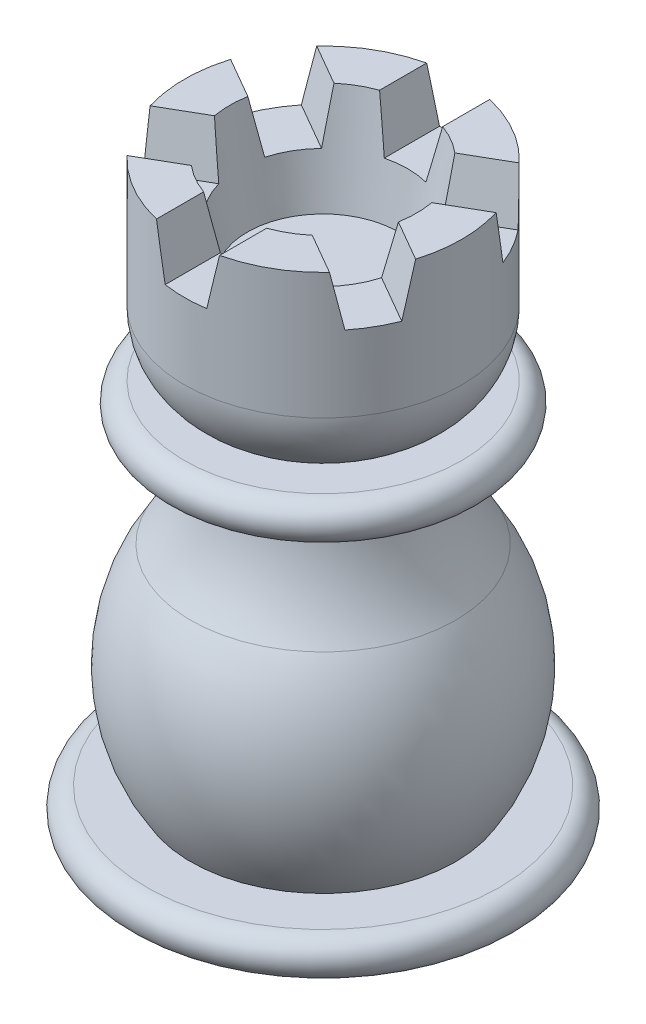
ISO-10303-21;
HEADER;
FILE_DESCRIPTION(('STEP AP214'),'2;1');
FILE_NAME('part.step','',(''),(''),'','','');
FILE_SCHEMA(('AUTOMOTIVE_DESIGN { 1 0 10303 214 1 1 1 1 }'));
ENDSEC;
DATA;
#1=APPLICATION_CONTEXT('core data for automotive mechanical design processes');
#2=APPLICATION_PROTOCOL_DEFINITION('international standard','automotive_design',2000,#1);
#3=PRODUCT_CONTEXT('',#1,'mechanical');
#4=PRODUCT('Part','Part','',(#3));
#5=PRODUCT_RELATED_PRODUCT_CATEGORY('part','',(#4));
#6=PRODUCT_DEFINITION_FORMATION('','',#4);
#7=PRODUCT_DEFINITION_CONTEXT('part definition',#1,'design');
#8=PRODUCT_DEFINITION('design','',#6,#7);
#9=PRODUCT_DEFINITION_SHAPE('','',#8);
#10=(LENGTH_UNIT() NAMED_UNIT(*) SI_UNIT(.MILLI.,.METRE.));
#11=(NAMED_UNIT(*) PLANE_ANGLE_UNIT() SI_UNIT($,.RADIAN.));
#12=(NAMED_UNIT(*) SI_UNIT($,.STERADIAN.) SOLID_ANGLE_UNIT());
#13=UNCERTAINTY_MEASURE_WITH_UNIT(LENGTH_MEASURE(1.E-05),#10,'distance_accuracy_value','');
#14=(GEOMETRIC_REPRESENTATION_CONTEXT(3) GLOBAL_UNCERTAINTY_ASSIGNED_CONTEXT((#13)) GLOBAL_UNIT_ASSIGNED_CONTEXT((#10,
#11,#12)) REPRESENTATION_CONTEXT('',''));
#15=CARTESIAN_POINT('',(0.,0.,0.));
#16=DIRECTION('',(0.,0.,1.));
#17=DIRECTION('',(1.,0.,0.));
#18=AXIS2_PLACEMENT_3D('',#15,#16,#17);
#19=CARTESIAN_POINT('',(11.,46.,0.));
#20=DIRECTION('',(0.,1.,0.));
#21=DIRECTION('',(-1.,0.,0.));
#22=AXIS2_PLACEMENT_3D('',#19,#20,#21);
#23=PLANE('',#22);
#24=CARTESIAN_POINT('',(0.,46.,0.));
#25=DIRECTION('',(0.,1.,0.));
#26=DIRECTION('',(0.,0.,1.));
#27=AXIS2_PLACEMENT_3D('',#24,#25,#26);
#28=CIRCLE('',#27,7.41061584566766);
#29=CARTESIAN_POINT('',(4.79155777999733,46.,-5.65315852006715));
#30=VERTEX_POINT('',#29);
#31=CARTESIAN_POINT('',(2.5,46.,-6.97619002121221));
#32=VERTEX_POINT('',#31);
#33=EDGE_CURVE('E315',#30,#32,#28,.T.);
#34=ORIENTED_EDGE('',*,*,#33,.F.);
#35=DIRECTION('',(0.866025403784443,0.,-0.499999999999992));
#36=VECTOR('',#35,1.);
#37=CARTESIAN_POINT('',(-19.5866968793294,46.,8.42163336986809));
#38=LINE('',#37,#36);
#39=CARTESIAN_POINT('',(8.02698765763981,46.,-7.52113483086816));
#40=VERTEX_POINT('',#39);
#41=EDGE_CURVE('E453',#30,#40,#38,.T.);
#42=ORIENTED_EDGE('',*,*,#41,.T.);
#43=CARTESIAN_POINT('',(0.,46.,0.));
#44=DIRECTION('',(0.,-1.,0.));
#45=DIRECTION('',(1.,0.,0.));
#46=AXIS2_PLACEMENT_3D('',#43,#44,#45);
#47=CIRCLE('',#46,11.);
#48=CARTESIAN_POINT('',(2.5,46.,-10.7121426428143));
#49=VERTEX_POINT('',#48);
#50=EDGE_CURVE('E314',#49,#40,#47,.T.);
#51=ORIENTED_EDGE('',*,*,#50,.F.);
#52=DIRECTION('',(0.,0.,1.));
#53=VECTOR('',#52,1.);
#54=CARTESIAN_POINT('',(2.5,46.,-15.5));
#55=LINE('',#54,#53);
#56=EDGE_CURVE('E274',#49,#32,#55,.T.);
#57=ORIENTED_EDGE('',*,*,#56,.T.);
#58=EDGE_LOOP('',(#34,#42,#51,#57));
#59=FACE_BOUND('',#58,.T.);
#60=ADVANCED_FACE('F42',(#59),#23,.T.);
#61=CARTESIAN_POINT('',(8.0269876576397,46.,7.52113483086827));
#62=VERTEX_POINT('',#61);
#63=CARTESIAN_POINT('',(2.5,46.,10.7121426428143));
#64=VERTEX_POINT('',#63);
#65=EDGE_CURVE('E309',#62,#64,#47,.T.);
#66=ORIENTED_EDGE('',*,*,#65,.F.);
#67=DIRECTION('',(-0.866025403784436,0.,-0.500000000000004));
#68=VECTOR('',#67,1.);
#69=CARTESIAN_POINT('',(17.0866968793294,46.,12.7517603887906));
#70=LINE('',#69,#68);
#71=CARTESIAN_POINT('',(4.79155777999723,46.,5.65315852006721));
#72=VERTEX_POINT('',#71);
#73=EDGE_CURVE('E236',#62,#72,#70,.T.);
#74=ORIENTED_EDGE('',*,*,#73,.T.);
#75=CARTESIAN_POINT('',(2.5,46.,6.9761900212122));
#76=VERTEX_POINT('',#75);
#77=EDGE_CURVE('E308',#76,#72,#28,.T.);
#78=ORIENTED_EDGE('',*,*,#77,.F.);
#79=EDGE_CURVE('E271',#76,#64,#55,.T.);
#80=ORIENTED_EDGE('',*,*,#79,.T.);
#81=EDGE_LOOP('',(#66,#74,#78,#80));
#82=FACE_BOUND('',#81,.T.);
#83=ADVANCED_FACE('F512',(#82),#23,.T.);
#84=CARTESIAN_POINT('',(-7.29155777999726,46.,-1.32303150114503));
#85=VERTEX_POINT('',#84);
#86=CARTESIAN_POINT('',(-7.29155777999728,46.,1.32303150114493));
#87=VERTEX_POINT('',#86);
#88=EDGE_CURVE('E468',#85,#87,#28,.T.);
#89=ORIENTED_EDGE('',*,*,#88,.F.);
#90=CARTESIAN_POINT('',(-10.5269876576397,46.,-3.19100781194609));
#91=VERTEX_POINT('',#90);
#92=EDGE_CURVE('E242',#85,#91,#70,.T.);
#93=ORIENTED_EDGE('',*,*,#92,.T.);
#94=CARTESIAN_POINT('',(-10.5269876576398,46.,3.19100781194594));
#95=VERTEX_POINT('',#94);
#96=EDGE_CURVE('E572',#95,#91,#47,.T.);
#97=ORIENTED_EDGE('',*,*,#96,.F.);
#98=EDGE_CURVE('E447',#95,#87,#38,.T.);
#99=ORIENTED_EDGE('',*,*,#98,.T.);
#100=EDGE_LOOP('',(#89,#93,#97,#99));
#101=FACE_BOUND('',#100,.T.);
#102=ADVANCED_FACE('F520',(#101),#23,.T.);
#103=DIRECTION('',(-0.866025403784436,0.,-0.500000000000004));
#104=VECTOR('',#103,1.);
#105=CARTESIAN_POINT('',(19.5866968793294,46.,8.42163336986841));
#106=LINE('',#105,#104);
#107=CARTESIAN_POINT('',(-4.79155777999724,46.,-5.65315852006722));
#108=VERTEX_POINT('',#107);
#109=CARTESIAN_POINT('',(-8.0269876576397,46.,-7.52113483086827));
#110=VERTEX_POINT('',#109);
#111=EDGE_CURVE('E250',#108,#110,#106,.T.);
#112=ORIENTED_EDGE('',*,*,#111,.F.);
#113=CARTESIAN_POINT('',(-2.5,46.,-6.9761900212122));
#114=VERTEX_POINT('',#113);
#115=EDGE_CURVE('E311',#114,#108,#28,.T.);
#116=ORIENTED_EDGE('',*,*,#115,.F.);
#117=DIRECTION('',(0.,0.,1.));
#118=VECTOR('',#117,1.);
#119=CARTESIAN_POINT('',(-2.5,46.,-15.5));
#120=LINE('',#119,#118);
#121=CARTESIAN_POINT('',(-2.5,46.,-10.7121426428143));
#122=VERTEX_POINT('',#121);
#123=EDGE_CURVE('E289',#122,#114,#120,.T.);
#124=ORIENTED_EDGE('',*,*,#123,.F.);
#125=EDGE_CURVE('E318',#110,#122,#47,.T.);
#126=ORIENTED_EDGE('',*,*,#125,.F.);
#127=EDGE_LOOP('',(#112,#116,#124,#126));
#128=FACE_BOUND('',#127,.T.);
#129=ADVANCED_FACE('F535',(#128),#23,.T.);
#130=CARTESIAN_POINT('',(10.5269876576397,46.,3.19100781194609));
#131=VERTEX_POINT('',#130);
#132=CARTESIAN_POINT('',(7.29155777999726,46.,1.32303150114503));
#133=VERTEX_POINT('',#132);
#134=EDGE_CURVE('E441',#131,#133,#106,.T.);
#135=ORIENTED_EDGE('',*,*,#134,.F.);
#136=CARTESIAN_POINT('',(10.5269876576398,46.,-3.19100781194594));
#137=VERTEX_POINT('',#136);
#138=EDGE_CURVE('E317',#137,#131,#47,.T.);
#139=ORIENTED_EDGE('',*,*,#138,.F.);
#140=DIRECTION('',(0.866025403784443,0.,-0.499999999999992));
#141=VECTOR('',#140,1.);
#142=CARTESIAN_POINT('',(-17.0866968793295,46.,12.7517603887903));
#143=LINE('',#142,#141);
#144=CARTESIAN_POINT('',(7.29155777999728,46.,-1.32303150114493));
#145=VERTEX_POINT('',#144);
#146=EDGE_CURVE('E424',#145,#137,#143,.T.);
#147=ORIENTED_EDGE('',*,*,#146,.F.);
#148=EDGE_CURVE('E313',#133,#145,#28,.T.);
#149=ORIENTED_EDGE('',*,*,#148,.F.);
#150=EDGE_LOOP('',(#135,#139,#147,#149));
#151=FACE_BOUND('',#150,.T.);
#152=ADVANCED_FACE('F427',(#151),#23,.T.);
#153=CARTESIAN_POINT('',(0.,0.,0.));
#154=DIRECTION('',(0.,-1.,0.));
#155=DIRECTION('',(1.,0.,0.));
#156=AXIS2_PLACEMENT_3D('',#153,#154,#155);
#157=PLANE('',#156);
#158=CARTESIAN_POINT('',(0.,0.,0.));
#159=DIRECTION('',(0.,-1.,0.));
#160=DIRECTION('',(1.,0.,0.));
#161=AXIS2_PLACEMENT_3D('',#158,#159,#160);
#162=CIRCLE('',#161,14.);
#163=CARTESIAN_POINT('',(14.,0.,0.));
#164=VERTEX_POINT('',#163);
#165=EDGE_CURVE('E351',#164,#164,#162,.T.);
#166=ORIENTED_EDGE('',*,*,#165,.T.);
#167=EDGE_LOOP('',(#166));
#168=FACE_BOUND('',#167,.T.);
#169=ADVANCED_FACE('F46',(#168),#157,.T.);
#170=CARTESIAN_POINT('',(0.,1.5,0.));
#171=DIRECTION('',(0.,-1.,0.));
#172=DIRECTION('',(1.,0.,0.));
#173=AXIS2_PLACEMENT_3D('',#170,#171,#172);
#174=TOROIDAL_SURFACE('',#173,14.,1.5);
#175=CARTESIAN_POINT('',(0.,3.,0.));
#176=DIRECTION('',(0.,-1.,0.));
#177=DIRECTION('',(1.,0.,0.));
#178=AXIS2_PLACEMENT_3D('',#175,#176,#177);
#179=CIRCLE('',#178,14.);
#180=CARTESIAN_POINT('',(14.,3.,0.));
#181=VERTEX_POINT('',#180);
#182=EDGE_CURVE('E346',#181,#181,#179,.T.);
#183=ORIENTED_EDGE('',*,*,#182,.T.);
#184=EDGE_LOOP('',(#183));
#185=FACE_BOUND('',#184,.T.);
#186=ORIENTED_EDGE('',*,*,#165,.F.);
#187=EDGE_LOOP('',(#186));
#188=FACE_BOUND('',#187,.T.);
#189=ADVANCED_FACE('F540',(#185,#188),#174,.T.);
#190=CARTESIAN_POINT('',(14.,3.,0.));
#191=DIRECTION('',(0.,1.,0.));
#192=DIRECTION('',(-1.,0.,0.));
#193=AXIS2_PLACEMENT_3D('',#190,#191,#192);
#194=PLANE('',#193);
#195=CARTESIAN_POINT('',(0.,3.,0.));
#196=DIRECTION('',(0.,-1.,0.));
#197=DIRECTION('',(1.,0.,0.));
#198=AXIS2_PLACEMENT_3D('',#195,#196,#197);
#199=CIRCLE('',#198,10.5);
#200=CARTESIAN_POINT('',(10.5,3.,0.));
#201=VERTEX_POINT('',#200);
#202=EDGE_CURVE('E343',#201,#201,#199,.T.);
#203=ORIENTED_EDGE('',*,*,#202,.T.);
#204=EDGE_LOOP('',(#203));
#205=FACE_BOUND('',#204,.T.);
#206=ORIENTED_EDGE('',*,*,#182,.F.);
#207=EDGE_LOOP('',(#206));
#208=FACE_BOUND('',#207,.T.);
#209=ADVANCED_FACE('F797',(#205,#208),#194,.T.);
#210=CARTESIAN_POINT('',(0.,11.2915619761802,0.));
#211=DIRECTION('',(0.,-1.,0.));
#212=DIRECTION('',(1.,0.,0.));
#213=AXIS2_PLACEMENT_3D('',#210,#211,#212);
#214=DEGENERATE_TOROIDAL_SURFACE('',#213,1.99999999980649,15.,.F.);
#215=CARTESIAN_POINT('',(0.,19.5832509410501,0.));
#216=DIRECTION('',(0.,-1.,0.));
#217=DIRECTION('',(1.,0.,0.));
#218=AXIS2_PLACEMENT_3D('',#215,#216,#217);
#219=CIRCLE('',#218,10.4999157643039);
#220=CARTESIAN_POINT('',(10.4999157643039,19.5832509410501,0.));
#221=VERTEX_POINT('',#220);
#222=EDGE_CURVE('E337',#221,#221,#219,.T.);
#223=ORIENTED_EDGE('',*,*,#222,.T.);
#224=EDGE_LOOP('',(#223));
#225=FACE_BOUND('',#224,.T.);
#226=ORIENTED_EDGE('',*,*,#202,.F.);
#227=EDGE_LOOP('',(#226));
#228=FACE_BOUND('',#227,.T.);
#229=ADVANCED_FACE('F794',(#225,#228),#214,.F.);
#230=CARTESIAN_POINT('',(0.,27.87493990592,0.));
#231=DIRECTION('',(0.,-1.,0.));
#232=DIRECTION('',(1.,0.,0.));
#233=AXIS2_PLACEMENT_3D('',#230,#231,#232);
#234=TOROIDAL_SURFACE('',#233,22.9998315284143,15.);
#235=CARTESIAN_POINT('',(0.,27.8038475772934,0.));
#236=DIRECTION('',(0.,-1.,0.));
#237=DIRECTION('',(1.,0.,0.));
#238=AXIS2_PLACEMENT_3D('',#235,#236,#237);
#239=CIRCLE('',#238,8.);
#240=CARTESIAN_POINT('',(8.,27.8038475772934,0.));
#241=VERTEX_POINT('',#240);
#242=EDGE_CURVE('E339',#241,#241,#239,.T.);
#243=ORIENTED_EDGE('',*,*,#242,.T.);
#244=EDGE_LOOP('',(#243));
#245=FACE_BOUND('',#244,.T.);
#246=ORIENTED_EDGE('',*,*,#222,.F.);
#247=EDGE_LOOP('',(#246));
#248=FACE_BOUND('',#247,.T.);
#249=ADVANCED_FACE('F781',(#245,#248),#234,.F.);
#250=CARTESIAN_POINT('',(8.,27.8038475772934,0.));
#251=DIRECTION('',(0.,-1.,0.));
#252=DIRECTION('',(1.,0.,0.));
#253=AXIS2_PLACEMENT_3D('',#250,#251,#252);
#254=PLANE('',#253);
#255=CARTESIAN_POINT('',(0.,27.8038475772934,0.));
#256=DIRECTION('',(0.,-1.,0.));
#257=DIRECTION('',(1.,0.,0.));
#258=AXIS2_PLACEMENT_3D('',#255,#256,#257);
#259=CIRCLE('',#258,11.);
#260=CARTESIAN_POINT('',(11.,27.8038475772934,0.));
#261=VERTEX_POINT('',#260);
#262=EDGE_CURVE('E335',#261,#261,#259,.T.);
#263=ORIENTED_EDGE('',*,*,#262,.T.);
#264=EDGE_LOOP('',(#263));
#265=FACE_BOUND('',#264,.T.);
#266=ORIENTED_EDGE('',*,*,#242,.F.);
#267=EDGE_LOOP('',(#266));
#268=FACE_BOUND('',#267,.T.);
#269=ADVANCED_FACE('F774',(#265,#268),#254,.T.);
#270=CARTESIAN_POINT('',(0.,29.3038475772934,0.));
#271=DIRECTION('',(0.,-1.,0.));
#272=DIRECTION('',(1.,0.,0.));
#273=AXIS2_PLACEMENT_3D('',#270,#271,#272);
#274=TOROIDAL_SURFACE('',#273,11.,1.5);
#275=CARTESIAN_POINT('',(0.,30.8038475772934,0.));
#276=DIRECTION('',(0.,-1.,0.));
#277=DIRECTION('',(1.,0.,0.));
#278=AXIS2_PLACEMENT_3D('',#275,#276,#277);
#279=CIRCLE('',#278,11.);
#280=CARTESIAN_POINT('',(11.,30.8038475772934,0.));
#281=VERTEX_POINT('',#280);
#282=EDGE_CURVE('E327',#281,#281,#279,.T.);
#283=ORIENTED_EDGE('',*,*,#282,.T.);
#284=EDGE_LOOP('',(#283));
#285=FACE_BOUND('',#284,.T.);
#286=ORIENTED_EDGE('',*,*,#262,.F.);
#287=EDGE_LOOP('',(#286));
#288=FACE_BOUND('',#287,.T.);
#289=ADVANCED_FACE('F762',(#285,#288),#274,.T.);
#290=CARTESIAN_POINT('',(11.,30.8038475772934,0.));
#291=DIRECTION('',(0.,1.,0.));
#292=DIRECTION('',(-1.,0.,0.));
#293=AXIS2_PLACEMENT_3D('',#290,#291,#292);
#294=PLANE('',#293);
#295=CARTESIAN_POINT('',(0.,30.8038475772934,0.));
#296=DIRECTION('',(0.,-1.,0.));
#297=DIRECTION('',(1.,0.,0.));
#298=AXIS2_PLACEMENT_3D('',#295,#296,#297);
#299=CIRCLE('',#298,8.);
#300=CARTESIAN_POINT('',(8.,30.8038475772934,0.));
#301=VERTEX_POINT('',#300);
#302=EDGE_CURVE('E322',#301,#301,#299,.T.);
#303=ORIENTED_EDGE('',*,*,#302,.T.);
#304=EDGE_LOOP('',(#303));
#305=FACE_BOUND('',#304,.T.);
#306=ORIENTED_EDGE('',*,*,#282,.F.);
#307=EDGE_LOOP('',(#306));
#308=FACE_BOUND('',#307,.T.);
#309=ADVANCED_FACE('F754',(#305,#308),#294,.T.);
#310=CARTESIAN_POINT('',(0.,36.,0.));
#311=DIRECTION('',(0.,-1.,0.));
#312=DIRECTION('',(1.,0.,0.));
#313=AXIS2_PLACEMENT_3D('',#310,#311,#312);
#314=DEGENERATE_TOROIDAL_SURFACE('',#313,5.,6.,.T.);
#315=CARTESIAN_POINT('',(0.,36.,0.));
#316=DIRECTION('',(0.,-1.,0.));
#317=DIRECTION('',(1.,0.,0.));
#318=AXIS2_PLACEMENT_3D('',#315,#316,#317);
#319=CIRCLE('',#318,11.);
#320=CARTESIAN_POINT('',(11.,36.,0.));
#321=VERTEX_POINT('',#320);
#322=EDGE_CURVE('E319',#321,#321,#319,.T.);
#323=ORIENTED_EDGE('',*,*,#322,.T.);
#324=EDGE_LOOP('',(#323));
#325=FACE_BOUND('',#324,.T.);
#326=ORIENTED_EDGE('',*,*,#302,.F.);
#327=EDGE_LOOP('',(#326));
#328=FACE_BOUND('',#327,.T.);
#329=ADVANCED_FACE('F529',(#325,#328),#314,.T.);
#330=CARTESIAN_POINT('',(0.,-2.04682153022546E-11,0.));
#331=DIRECTION('',(0.,-1.,0.));
#332=DIRECTION('',(1.,0.,0.));
#333=AXIS2_PLACEMENT_3D('',#330,#331,#332);
#334=CYLINDRICAL_SURFACE('',#333,11.);
#335=CARTESIAN_POINT('',(0.,34.2384247263037,0.));
#336=DIRECTION('',(-0.489073800366907,-0.207911690817756,0.847100670886272));
#337=DIRECTION('',(0.103955845408879,-0.978147600733806,-0.180056805991952));
#338=AXIS2_PLACEMENT_3D('',#335,#336,#337);
#339=ELLIPSE('',#338,52.9070777921862,11.);
#340=CARTESIAN_POINT('',(-10.2434156854571,42.,-4.00904416225749));
#341=VERTEX_POINT('',#340);
#342=EDGE_CURVE('E270',#341,#91,#339,.F.);
#343=ORIENTED_EDGE('',*,*,#342,.F.);
#344=CARTESIAN_POINT('',(0.,42.,0.));
#345=DIRECTION('',(0.,-1.,0.));
#346=DIRECTION('',(1.,0.,0.));
#347=AXIS2_PLACEMENT_3D('',#344,#345,#346);
#348=CIRCLE('',#347,11.);
#349=CARTESIAN_POINT('',(-8.59364193213719,42.,-6.8665361240012));
#350=VERTEX_POINT('',#349);
#351=EDGE_CURVE('E220',#350,#341,#348,.F.);
#352=ORIENTED_EDGE('',*,*,#351,.F.);
#353=CARTESIAN_POINT('',(0.,34.2384247263037,0.));
#354=DIRECTION('',(0.489073800366907,-0.207911690817756,-0.847100670886272));
#355=DIRECTION('',(-0.103955845408879,-0.978147600733806,0.180056805991952));
#356=AXIS2_PLACEMENT_3D('',#353,#354,#355);
#357=ELLIPSE('',#356,52.9070777921862,11.);
#358=EDGE_CURVE('E262',#110,#350,#357,.F.);
#359=ORIENTED_EDGE('',*,*,#358,.F.);
#360=ORIENTED_EDGE('',*,*,#125,.T.);
#361=CARTESIAN_POINT('',(0.,34.2384247263037,0.));
#362=DIRECTION('',(-0.978147600733806,-0.207911690817756,0.));
#363=DIRECTION('',(0.207911690817756,-0.978147600733806,0.));
#364=AXIS2_PLACEMENT_3D('',#361,#362,#363);
#365=ELLIPSE('',#364,52.9070777921862,11.);
#366=CARTESIAN_POINT('',(-1.64977375331992,42.,-10.8755802862586));
#367=VERTEX_POINT('',#366);
#368=EDGE_CURVE('E295',#367,#122,#365,.F.);
#369=ORIENTED_EDGE('',*,*,#368,.F.);
#370=CARTESIAN_POINT('',(0.,42.,0.));
#371=DIRECTION('',(0.,-1.,0.));
#372=DIRECTION('',(0.,0.,-1.));
#373=AXIS2_PLACEMENT_3D('',#370,#371,#372);
#374=CIRCLE('',#373,11.);
#375=CARTESIAN_POINT('',(1.64977375331992,42.,-10.8755802862586));
#376=VERTEX_POINT('',#375);
#377=EDGE_CURVE('E291',#376,#367,#374,.F.);
#378=ORIENTED_EDGE('',*,*,#377,.F.);
#379=CARTESIAN_POINT('',(0.,34.2384247263037,0.));
#380=DIRECTION('',(0.978147600733806,-0.207911690817756,0.));
#381=DIRECTION('',(-0.207911690817756,-0.978147600733806,0.));
#382=AXIS2_PLACEMENT_3D('',#379,#380,#381);
#383=ELLIPSE('',#382,52.9070777921862,11.);
#384=EDGE_CURVE('E296',#49,#376,#383,.F.);
#385=ORIENTED_EDGE('',*,*,#384,.F.);
#386=ORIENTED_EDGE('',*,*,#50,.T.);
#387=CARTESIAN_POINT('',(0.,34.2384247263037,0.));
#388=DIRECTION('',(-0.489073800366895,-0.207911690817756,-0.847100670886279));
#389=DIRECTION('',(0.103955845408876,-0.978147600733806,0.180056805991954));
#390=AXIS2_PLACEMENT_3D('',#387,#388,#389);
#391=ELLIPSE('',#390,52.9070777921862,11.);
#392=CARTESIAN_POINT('',(8.59364193213729,42.,-6.86653612400108));
#393=VERTEX_POINT('',#392);
#394=EDGE_CURVE('E251',#393,#40,#391,.F.);
#395=ORIENTED_EDGE('',*,*,#394,.F.);
#396=CARTESIAN_POINT('',(10.2434156854572,42.,-4.00904416225735));
#397=VERTEX_POINT('',#396);
#398=EDGE_CURVE('E217',#397,#393,#348,.F.);
#399=ORIENTED_EDGE('',*,*,#398,.F.);
#400=CARTESIAN_POINT('',(0.,34.2384247263037,0.));
#401=DIRECTION('',(0.489073800366895,-0.207911690817756,0.847100670886279));
#402=DIRECTION('',(-0.103955845408876,-0.978147600733806,-0.180056805991954));
#403=AXIS2_PLACEMENT_3D('',#400,#401,#402);
#404=ELLIPSE('',#403,52.9070777921862,11.);
#405=EDGE_CURVE('E241',#137,#397,#404,.F.);
#406=ORIENTED_EDGE('',*,*,#405,.F.);
#407=ORIENTED_EDGE('',*,*,#138,.T.);
#408=CARTESIAN_POINT('',(0.,34.2384247263037,0.));
#409=DIRECTION('',(0.489073800366907,-0.207911690817756,-0.847100670886272));
#410=DIRECTION('',(-0.103955845408879,-0.978147600733806,0.180056805991952));
#411=AXIS2_PLACEMENT_3D('',#408,#409,#410);
#412=ELLIPSE('',#411,52.9070777921862,11.);
#413=CARTESIAN_POINT('',(10.2434156854571,42.,4.00904416225749));
#414=VERTEX_POINT('',#413);
#415=EDGE_CURVE('E258',#414,#131,#412,.F.);
#416=ORIENTED_EDGE('',*,*,#415,.F.);
#417=CARTESIAN_POINT('',(8.59364193213719,42.,6.8665361240012));
#418=VERTEX_POINT('',#417);
#419=EDGE_CURVE('E256',#418,#414,#348,.F.);
#420=ORIENTED_EDGE('',*,*,#419,.F.);
#421=CARTESIAN_POINT('',(0.,34.2384247263037,0.));
#422=DIRECTION('',(-0.489073800366907,-0.207911690817756,0.847100670886272));
#423=DIRECTION('',(0.103955845408879,-0.978147600733806,-0.180056805991952));
#424=AXIS2_PLACEMENT_3D('',#421,#422,#423);
#425=ELLIPSE('',#424,52.9070777921862,11.);
#426=EDGE_CURVE('E261',#62,#418,#425,.F.);
#427=ORIENTED_EDGE('',*,*,#426,.F.);
#428=ORIENTED_EDGE('',*,*,#65,.T.);
#429=CARTESIAN_POINT('',(1.64977375331992,42.,10.8755802862586));
#430=VERTEX_POINT('',#429);
#431=EDGE_CURVE('E297',#430,#64,#383,.F.);
#432=ORIENTED_EDGE('',*,*,#431,.F.);
#433=CARTESIAN_POINT('',(-1.64977375331992,42.,10.8755802862586));
#434=VERTEX_POINT('',#433);
#435=EDGE_CURVE('E299',#434,#430,#374,.F.);
#436=ORIENTED_EDGE('',*,*,#435,.F.);
#437=CARTESIAN_POINT('',(-2.5,46.,10.7121426428143));
#438=VERTEX_POINT('',#437);
#439=EDGE_CURVE('E288',#438,#434,#365,.F.);
#440=ORIENTED_EDGE('',*,*,#439,.F.);
#441=CARTESIAN_POINT('',(-8.02698765763981,46.,7.52113483086816));
#442=VERTEX_POINT('',#441);
#443=EDGE_CURVE('E232',#438,#442,#47,.T.);
#444=ORIENTED_EDGE('',*,*,#443,.T.);
#445=CARTESIAN_POINT('',(0.,34.2384247263037,0.));
#446=DIRECTION('',(0.489073800366895,-0.207911690817756,0.847100670886279));
#447=DIRECTION('',(-0.103955845408876,-0.978147600733806,-0.180056805991954));
#448=AXIS2_PLACEMENT_3D('',#445,#446,#447);
#449=ELLIPSE('',#448,52.9070777921862,11.);
#450=CARTESIAN_POINT('',(-8.59364193213728,42.,6.86653612400107));
#451=VERTEX_POINT('',#450);
#452=EDGE_CURVE('E225',#451,#442,#449,.F.);
#453=ORIENTED_EDGE('',*,*,#452,.F.);
#454=CARTESIAN_POINT('',(-10.2434156854572,42.,4.00904416225735));
#455=VERTEX_POINT('',#454);
#456=EDGE_CURVE('E206',#455,#451,#348,.F.);
#457=ORIENTED_EDGE('',*,*,#456,.F.);
#458=CARTESIAN_POINT('',(0.,34.2384247263037,0.));
#459=DIRECTION('',(-0.489073800366895,-0.207911690817756,-0.847100670886279));
#460=DIRECTION('',(0.103955845408876,-0.978147600733806,0.180056805991954));
#461=AXIS2_PLACEMENT_3D('',#458,#459,#460);
#462=ELLIPSE('',#461,52.9070777921862,11.);
#463=EDGE_CURVE('E240',#95,#455,#462,.F.);
#464=ORIENTED_EDGE('',*,*,#463,.F.);
#465=ORIENTED_EDGE('',*,*,#96,.T.);
#466=EDGE_LOOP('',(#343,#352,#359,#360,#369,#378,#385,#386,#395,#399,#406,#407,#416,#420,#427,
#428,#432,#436,#440,#444,#453,#457,#464,#465));
#467=FACE_BOUND('',#466,.T.);
#468=ORIENTED_EDGE('',*,*,#322,.F.);
#469=EDGE_LOOP('',(#468));
#470=FACE_BOUND('',#469,.T.);
#471=ADVANCED_FACE('F234',(#467,#470),#334,.T.);
#472=CARTESIAN_POINT('',(-4.79155777999731,46.,5.65315852006715));
#473=VERTEX_POINT('',#472);
#474=EDGE_CURVE('E435',#442,#473,#143,.T.);
#475=ORIENTED_EDGE('',*,*,#474,.F.);
#476=ORIENTED_EDGE('',*,*,#443,.F.);
#477=CARTESIAN_POINT('',(-2.5,46.,6.9761900212122));
#478=VERTEX_POINT('',#477);
#479=EDGE_CURVE('E269',#478,#438,#120,.T.);
#480=ORIENTED_EDGE('',*,*,#479,.F.);
#481=EDGE_CURVE('E302',#473,#478,#28,.T.);
#482=ORIENTED_EDGE('',*,*,#481,.F.);
#483=EDGE_LOOP('',(#475,#476,#480,#482));
#484=FACE_BOUND('',#483,.T.);
#485=ADVANCED_FACE('F511',(#484),#23,.T.);
#486=CARTESIAN_POINT('',(0.,38.,0.));
#487=DIRECTION('',(0.,1.,0.));
#488=DIRECTION('',(0.,0.,1.));
#489=AXIS2_PLACEMENT_3D('',#486,#487,#488);
#490=CONICAL_SURFACE('',#489,6.,0.174532925199426);
#491=CARTESIAN_POINT('',(-7.09832491764702,101.028410995151,12.2946594059967));
#492=DIRECTION('',(-0.489073800366907,-0.207911690817756,0.847100670886272));
#493=DIRECTION('',(-0.103955845408879,0.978147600733806,0.180056805991952));
#494=AXIS2_PLACEMENT_3D('',#491,#492,#493);
#495=ELLIPSE('',#494,82.3119149400188,9.55671284905598);
#496=CARTESIAN_POINT('',(-6.45334587332646,42.,-1.82084633597635));
#497=VERTEX_POINT('',#496);
#498=EDGE_CURVE('E11',#85,#497,#495,.T.);
#499=ORIENTED_EDGE('',*,*,#498,.F.);
#500=ORIENTED_EDGE('',*,*,#88,.T.);
#501=CARTESIAN_POINT('',(-7.09832491764691,101.028410995151,-12.2946594059969));
#502=DIRECTION('',(-0.489073800366895,-0.207911690817756,-0.847100670886279));
#503=DIRECTION('',(-0.103955845408876,0.978147600733806,-0.180056805991954));
#504=AXIS2_PLACEMENT_3D('',#501,#502,#503);
#505=ELLIPSE('',#504,82.3119149400196,9.55671284905602);
#506=CARTESIAN_POINT('',(-6.45334587332648,42.,1.82084633597626));
#507=VERTEX_POINT('',#506);
#508=EDGE_CURVE('E374',#507,#87,#505,.T.);
#509=ORIENTED_EDGE('',*,*,#508,.F.);
#510=CARTESIAN_POINT('',(0.,42.,0.));
#511=DIRECTION('',(0.,-1.,0.));
#512=DIRECTION('',(1.,0.,0.));
#513=AXIS2_PLACEMENT_3D('',#510,#511,#512);
#514=CIRCLE('',#513,6.70530792283383);
#515=CARTESIAN_POINT('',(-4.80357212000659,42.,4.67833829771999));
#516=VERTEX_POINT('',#515);
#517=EDGE_CURVE('E375',#516,#507,#514,.T.);
#518=ORIENTED_EDGE('',*,*,#517,.F.);
#519=CARTESIAN_POINT('',(7.0983249176469,101.028410995151,12.2946594059969));
#520=DIRECTION('',(0.489073800366895,-0.207911690817756,0.847100670886279));
#521=DIRECTION('',(0.103955845408876,0.978147600733806,0.180056805991954));
#522=AXIS2_PLACEMENT_3D('',#519,#520,#521);
#523=ELLIPSE('',#522,82.3119149400195,9.55671284905602);
#524=EDGE_CURVE('E223',#473,#516,#523,.T.);
#525=ORIENTED_EDGE('',*,*,#524,.F.);
#526=ORIENTED_EDGE('',*,*,#481,.T.);
#527=CARTESIAN_POINT('',(-14.196649835294,101.028410995151,0.));
#528=DIRECTION('',(-0.978147600733806,-0.207911690817756,0.));
#529=DIRECTION('',(-0.207911690817756,0.978147600733806,0.));
#530=AXIS2_PLACEMENT_3D('',#527,#528,#529);
#531=ELLIPSE('',#530,82.3119149400196,9.55671284905602);
#532=CARTESIAN_POINT('',(-1.64977375331992,42.,6.49918463369636));
#533=VERTEX_POINT('',#532);
#534=EDGE_CURVE('E359',#533,#478,#531,.T.);
#535=ORIENTED_EDGE('',*,*,#534,.F.);
#536=CARTESIAN_POINT('',(0.,42.,0.));
#537=DIRECTION('',(0.,-1.,0.));
#538=DIRECTION('',(0.,0.,-1.));
#539=AXIS2_PLACEMENT_3D('',#536,#537,#538);
#540=CIRCLE('',#539,6.70530792283383);
#541=CARTESIAN_POINT('',(1.64977375331992,42.,6.49918463369636));
#542=VERTEX_POINT('',#541);
#543=EDGE_CURVE('E357',#542,#533,#540,.T.);
#544=ORIENTED_EDGE('',*,*,#543,.F.);
#545=CARTESIAN_POINT('',(14.196649835294,101.028410995151,0.));
#546=DIRECTION('',(0.978147600733806,-0.207911690817756,0.));
#547=DIRECTION('',(0.207911690817756,0.978147600733806,0.));
#548=AXIS2_PLACEMENT_3D('',#545,#546,#547);
#549=ELLIPSE('',#548,82.3119149400196,9.55671284905602);
#550=EDGE_CURVE('E364',#76,#542,#549,.T.);
#551=ORIENTED_EDGE('',*,*,#550,.F.);
#552=ORIENTED_EDGE('',*,*,#77,.T.);
#553=CARTESIAN_POINT('',(-7.09832491764702,101.028410995151,12.2946594059967));
#554=DIRECTION('',(-0.489073800366907,-0.207911690817756,0.847100670886272));
#555=DIRECTION('',(-0.103955845408879,0.978147600733806,0.180056805991952));
#556=AXIS2_PLACEMENT_3D('',#553,#554,#555);
#557=ELLIPSE('',#556,82.3119149400188,9.55671284905598);
#558=CARTESIAN_POINT('',(4.80357212000652,42.,4.67833829772006));
#559=VERTEX_POINT('',#558);
#560=EDGE_CURVE('E388',#559,#72,#557,.T.);
#561=ORIENTED_EDGE('',*,*,#560,.F.);
#562=CARTESIAN_POINT('',(6.45334587332645,42.,1.82084633597635));
#563=VERTEX_POINT('',#562);
#564=EDGE_CURVE('E386',#563,#559,#514,.T.);
#565=ORIENTED_EDGE('',*,*,#564,.F.);
#566=CARTESIAN_POINT('',(7.09832491764702,101.028410995151,-12.2946594059967));
#567=DIRECTION('',(0.489073800366907,-0.207911690817756,-0.847100670886272));
#568=DIRECTION('',(0.103955845408879,0.978147600733806,-0.180056805991952));
#569=AXIS2_PLACEMENT_3D('',#566,#567,#568);
#570=ELLIPSE('',#569,82.3119149400189,9.55671284905599);
#571=EDGE_CURVE('E387',#133,#563,#570,.T.);
#572=ORIENTED_EDGE('',*,*,#571,.F.);
#573=ORIENTED_EDGE('',*,*,#148,.T.);
#574=CARTESIAN_POINT('',(7.0983249176469,101.028410995151,12.2946594059969));
#575=DIRECTION('',(0.489073800366895,-0.207911690817756,0.847100670886279));
#576=DIRECTION('',(0.103955845408876,0.978147600733806,0.180056805991954));
#577=AXIS2_PLACEMENT_3D('',#574,#575,#576);
#578=ELLIPSE('',#577,82.3119149400195,9.55671284905602);
#579=CARTESIAN_POINT('',(6.45334587332649,42.,-1.82084633597626));
#580=VERTEX_POINT('',#579);
#581=EDGE_CURVE('E379',#580,#145,#578,.T.);
#582=ORIENTED_EDGE('',*,*,#581,.F.);
#583=CARTESIAN_POINT('',(4.8035721200066,42.,-4.67833829772));
#584=VERTEX_POINT('',#583);
#585=EDGE_CURVE('E380',#584,#580,#514,.T.);
#586=ORIENTED_EDGE('',*,*,#585,.F.);
#587=CARTESIAN_POINT('',(-7.09832491764691,101.028410995151,-12.2946594059969));
#588=DIRECTION('',(-0.489073800366895,-0.207911690817756,-0.847100670886279));
#589=DIRECTION('',(-0.103955845408876,0.978147600733806,-0.180056805991954));
#590=AXIS2_PLACEMENT_3D('',#587,#588,#589);
#591=ELLIPSE('',#590,82.3119149400196,9.55671284905602);
#592=EDGE_CURVE('E382',#30,#584,#591,.T.);
#593=ORIENTED_EDGE('',*,*,#592,.F.);
#594=ORIENTED_EDGE('',*,*,#33,.T.);
#595=CARTESIAN_POINT('',(1.64977375331992,42.,-6.49918463369636));
#596=VERTEX_POINT('',#595);
#597=EDGE_CURVE('E369',#596,#32,#549,.T.);
#598=ORIENTED_EDGE('',*,*,#597,.F.);
#599=CARTESIAN_POINT('',(-1.64977375331992,42.,-6.49918463369637));
#600=VERTEX_POINT('',#599);
#601=EDGE_CURVE('E368',#600,#596,#540,.T.);
#602=ORIENTED_EDGE('',*,*,#601,.F.);
#603=EDGE_CURVE('E363',#114,#600,#531,.T.);
#604=ORIENTED_EDGE('',*,*,#603,.F.);
#605=ORIENTED_EDGE('',*,*,#115,.T.);
#606=CARTESIAN_POINT('',(7.09832491764702,101.028410995151,-12.2946594059967));
#607=DIRECTION('',(0.489073800366907,-0.207911690817756,-0.847100670886272));
#608=DIRECTION('',(0.103955845408879,0.978147600733806,-0.180056805991952));
#609=AXIS2_PLACEMENT_3D('',#606,#607,#608);
#610=ELLIPSE('',#609,82.3119149400189,9.55671284905599);
#611=CARTESIAN_POINT('',(-4.80357212000652,42.,-4.67833829772006));
#612=VERTEX_POINT('',#611);
#613=EDGE_CURVE('E52',#612,#108,#610,.T.);
#614=ORIENTED_EDGE('',*,*,#613,.F.);
#615=EDGE_CURVE('E376',#497,#612,#514,.T.);
#616=ORIENTED_EDGE('',*,*,#615,.F.);
#617=EDGE_LOOP('',(#499,#500,#509,#518,#525,#526,#535,#544,#551,#552,#561,#565,#572,#573,#582,
#586,#593,#594,#598,#602,#604,#605,#614,#616));
#618=FACE_BOUND('',#617,.T.);
#619=CARTESIAN_POINT('',(0.,38.,0.));
#620=DIRECTION('',(0.,1.,0.));
#621=DIRECTION('',(0.,0.,1.));
#622=AXIS2_PLACEMENT_3D('',#619,#620,#621);
#623=CIRCLE('',#622,6.);
#624=CARTESIAN_POINT('',(0.,38.,6.));
#625=VERTEX_POINT('',#624);
#626=EDGE_CURVE('E304',#625,#625,#623,.T.);
#627=ORIENTED_EDGE('',*,*,#626,.F.);
#628=EDGE_LOOP('',(#627));
#629=FACE_BOUND('',#628,.T.);
#630=ADVANCED_FACE('F416',(#618,#629),#490,.F.);
#631=CARTESIAN_POINT('',(0.,38.,0.));
#632=DIRECTION('',(0.,1.,0.));
#633=DIRECTION('',(-1.,0.,0.));
#634=AXIS2_PLACEMENT_3D('',#631,#632,#633);
#635=PLANE('',#634);
#636=ORIENTED_EDGE('',*,*,#626,.T.);
#637=EDGE_LOOP('',(#636));
#638=FACE_BOUND('',#637,.T.);
#639=ADVANCED_FACE('F526',(#638),#635,.T.);
#640=CARTESIAN_POINT('',(-2.5,46.,-15.5));
#641=DIRECTION('',(-0.978147600733806,-0.207911690817756,0.));
#642=DIRECTION('',(0.207911690817756,-0.978147600733806,0.));
#643=AXIS2_PLACEMENT_3D('',#640,#641,#642);
#644=PLANE('',#643);
#645=ORIENTED_EDGE('',*,*,#439,.T.);
#646=DIRECTION('',(0.,0.,1.));
#647=VECTOR('',#646,1.);
#648=CARTESIAN_POINT('',(-1.64977375331992,42.,-15.5));
#649=LINE('',#648,#647);
#650=EDGE_CURVE('E281',#533,#434,#649,.T.);
#651=ORIENTED_EDGE('',*,*,#650,.F.);
#652=ORIENTED_EDGE('',*,*,#534,.T.);
#653=ORIENTED_EDGE('',*,*,#479,.T.);
#654=EDGE_LOOP('',(#645,#651,#652,#653));
#655=FACE_BOUND('',#654,.T.);
#656=ADVANCED_FACE('F681',(#655),#644,.F.);
#657=CARTESIAN_POINT('',(-1.64977375331992,42.,-15.5));
#658=DIRECTION('',(0.,-1.,0.));
#659=DIRECTION('',(0.,0.,-1.));
#660=AXIS2_PLACEMENT_3D('',#657,#658,#659);
#661=PLANE('',#660);
#662=ORIENTED_EDGE('',*,*,#435,.T.);
#663=DIRECTION('',(0.,0.,1.));
#664=VECTOR('',#663,1.);
#665=CARTESIAN_POINT('',(1.64977375331992,42.,-15.5));
#666=LINE('',#665,#664);
#667=EDGE_CURVE('E280',#542,#430,#666,.T.);
#668=ORIENTED_EDGE('',*,*,#667,.F.);
#669=ORIENTED_EDGE('',*,*,#543,.T.);
#670=ORIENTED_EDGE('',*,*,#650,.T.);
#671=EDGE_LOOP('',(#662,#668,#669,#670));
#672=FACE_BOUND('',#671,.T.);
#673=ADVANCED_FACE('F574',(#672),#661,.F.);
#674=CARTESIAN_POINT('',(1.64977375331992,42.,-15.5));
#675=DIRECTION('',(0.978147600733806,-0.207911690817756,0.));
#676=DIRECTION('',(0.207911690817756,0.978147600733806,0.));
#677=AXIS2_PLACEMENT_3D('',#674,#675,#676);
#678=PLANE('',#677);
#679=ORIENTED_EDGE('',*,*,#431,.T.);
#680=ORIENTED_EDGE('',*,*,#79,.F.);
#681=ORIENTED_EDGE('',*,*,#550,.T.);
#682=ORIENTED_EDGE('',*,*,#667,.T.);
#683=EDGE_LOOP('',(#679,#680,#681,#682));
#684=FACE_BOUND('',#683,.T.);
#685=ADVANCED_FACE('F561',(#684),#678,.F.);
#686=ORIENTED_EDGE('',*,*,#368,.T.);
#687=ORIENTED_EDGE('',*,*,#123,.T.);
#688=ORIENTED_EDGE('',*,*,#603,.T.);
#689=EDGE_CURVE('E284',#367,#600,#649,.T.);
#690=ORIENTED_EDGE('',*,*,#689,.F.);
#691=EDGE_LOOP('',(#686,#687,#688,#690));
#692=FACE_BOUND('',#691,.T.);
#693=ADVANCED_FACE('F559',(#692),#644,.F.);
#694=ORIENTED_EDGE('',*,*,#384,.T.);
#695=EDGE_CURVE('E277',#376,#596,#666,.T.);
#696=ORIENTED_EDGE('',*,*,#695,.T.);
#697=ORIENTED_EDGE('',*,*,#597,.T.);
#698=ORIENTED_EDGE('',*,*,#56,.F.);
#699=EDGE_LOOP('',(#694,#696,#697,#698));
#700=FACE_BOUND('',#699,.T.);
#701=ADVANCED_FACE('F486',(#700),#678,.F.);
#702=ORIENTED_EDGE('',*,*,#377,.T.);
#703=ORIENTED_EDGE('',*,*,#689,.T.);
#704=ORIENTED_EDGE('',*,*,#601,.T.);
#705=ORIENTED_EDGE('',*,*,#695,.F.);
#706=EDGE_LOOP('',(#702,#703,#704,#705));
#707=FACE_BOUND('',#706,.T.);
#708=ADVANCED_FACE('F555',(#707),#661,.F.);
#709=CARTESIAN_POINT('',(-17.0866968793295,46.,12.7517603887903));
#710=DIRECTION('',(0.489073800366895,-0.207911690817756,0.847100670886279));
#711=DIRECTION('',(0.866025403784443,0.,-0.499999999999992));
#712=AXIS2_PLACEMENT_3D('',#709,#710,#711);
#713=PLANE('',#712);
#714=ORIENTED_EDGE('',*,*,#452,.T.);
#715=ORIENTED_EDGE('',*,*,#474,.T.);
#716=ORIENTED_EDGE('',*,*,#524,.T.);
#717=DIRECTION('',(0.866025403784443,0.,-0.499999999999992));
#718=VECTOR('',#717,1.);
#719=CARTESIAN_POINT('',(-17.5118100026695,42.,12.0154428602011));
#720=LINE('',#719,#718);
#721=EDGE_CURVE('E207',#451,#516,#720,.T.);
#722=ORIENTED_EDGE('',*,*,#721,.F.);
#723=EDGE_LOOP('',(#714,#715,#716,#722));
#724=FACE_BOUND('',#723,.T.);
#725=ADVANCED_FACE('F222',(#724),#713,.F.);
#726=CARTESIAN_POINT('',(-19.1615837559894,42.,9.15795089845734));
#727=DIRECTION('',(-0.489073800366895,-0.207911690817756,-0.847100670886279));
#728=DIRECTION('',(-0.866025403784443,0.,0.499999999999992));
#729=AXIS2_PLACEMENT_3D('',#726,#727,#728);
#730=PLANE('',#729);
#731=ORIENTED_EDGE('',*,*,#463,.T.);
#732=DIRECTION('',(0.866025403784443,0.,-0.499999999999992));
#733=VECTOR('',#732,1.);
#734=CARTESIAN_POINT('',(-19.1615837559894,42.,9.15795089845734));
#735=LINE('',#734,#733);
#736=EDGE_CURVE('E215',#455,#507,#735,.T.);
#737=ORIENTED_EDGE('',*,*,#736,.T.);
#738=ORIENTED_EDGE('',*,*,#508,.T.);
#739=ORIENTED_EDGE('',*,*,#98,.F.);
#740=EDGE_LOOP('',(#731,#737,#738,#739));
#741=FACE_BOUND('',#740,.T.);
#742=ADVANCED_FACE('F470',(#741),#730,.F.);
#743=CARTESIAN_POINT('',(19.1615837559893,42.,9.15795089845765));
#744=DIRECTION('',(0.,-1.,0.));
#745=DIRECTION('',(1.,0.,0.));
#746=AXIS2_PLACEMENT_3D('',#743,#744,#745);
#747=PLANE('',#746);
#748=ORIENTED_EDGE('',*,*,#456,.T.);
#749=ORIENTED_EDGE('',*,*,#721,.T.);
#750=ORIENTED_EDGE('',*,*,#517,.T.);
#751=ORIENTED_EDGE('',*,*,#736,.F.);
#752=EDGE_LOOP('',(#748,#749,#750,#751));
#753=FACE_BOUND('',#752,.T.);
#754=ADVANCED_FACE('F208',(#753),#747,.F.);
#755=ORIENTED_EDGE('',*,*,#394,.T.);
#756=ORIENTED_EDGE('',*,*,#41,.F.);
#757=ORIENTED_EDGE('',*,*,#592,.T.);
#758=EDGE_CURVE('E226',#584,#393,#735,.T.);
#759=ORIENTED_EDGE('',*,*,#758,.T.);
#760=EDGE_LOOP('',(#755,#756,#757,#759));
#761=FACE_BOUND('',#760,.T.);
#762=ADVANCED_FACE('F496',(#761),#730,.F.);
#763=ORIENTED_EDGE('',*,*,#405,.T.);
#764=EDGE_CURVE('E66',#580,#397,#720,.T.);
#765=ORIENTED_EDGE('',*,*,#764,.F.);
#766=ORIENTED_EDGE('',*,*,#581,.T.);
#767=ORIENTED_EDGE('',*,*,#146,.T.);
#768=EDGE_LOOP('',(#763,#765,#766,#767));
#769=FACE_BOUND('',#768,.T.);
#770=ADVANCED_FACE('F421',(#769),#713,.F.);
#771=ORIENTED_EDGE('',*,*,#398,.T.);
#772=ORIENTED_EDGE('',*,*,#758,.F.);
#773=ORIENTED_EDGE('',*,*,#585,.T.);
#774=ORIENTED_EDGE('',*,*,#764,.T.);
#775=EDGE_LOOP('',(#771,#772,#773,#774));
#776=FACE_BOUND('',#775,.T.);
#777=ADVANCED_FACE('F414',(#776),#747,.F.);
#778=CARTESIAN_POINT('',(19.5866968793294,46.,8.42163336986841));
#779=DIRECTION('',(0.489073800366907,-0.207911690817756,-0.847100670886272));
#780=DIRECTION('',(-0.866025403784436,0.,-0.500000000000004));
#781=AXIS2_PLACEMENT_3D('',#778,#779,#780);
#782=PLANE('',#781);
#783=ORIENTED_EDGE('',*,*,#415,.T.);
#784=ORIENTED_EDGE('',*,*,#134,.T.);
#785=ORIENTED_EDGE('',*,*,#571,.T.);
#786=DIRECTION('',(-0.866025403784436,0.,-0.500000000000004));
#787=VECTOR('',#786,1.);
#788=CARTESIAN_POINT('',(19.1615837559893,42.,9.15795089845765));
#789=LINE('',#788,#787);
#790=EDGE_CURVE('E442',#414,#563,#789,.T.);
#791=ORIENTED_EDGE('',*,*,#790,.F.);
#792=EDGE_LOOP('',(#783,#784,#785,#791));
#793=FACE_BOUND('',#792,.T.);
#794=ADVANCED_FACE('F589',(#793),#782,.F.);
#795=ORIENTED_EDGE('',*,*,#419,.T.);
#796=ORIENTED_EDGE('',*,*,#790,.T.);
#797=ORIENTED_EDGE('',*,*,#564,.T.);
#798=DIRECTION('',(-0.866025403784436,0.,-0.500000000000004));
#799=VECTOR('',#798,1.);
#800=CARTESIAN_POINT('',(17.5118100026694,42.,12.0154428602014));
#801=LINE('',#800,#799);
#802=EDGE_CURVE('E438',#418,#559,#801,.T.);
#803=ORIENTED_EDGE('',*,*,#802,.F.);
#804=EDGE_LOOP('',(#795,#796,#797,#803));
#805=FACE_BOUND('',#804,.T.);
#806=ADVANCED_FACE('F588',(#805),#747,.F.);
#807=CARTESIAN_POINT('',(17.5118100026694,42.,12.0154428602014));
#808=DIRECTION('',(-0.489073800366907,-0.207911690817756,0.847100670886272));
#809=DIRECTION('',(0.866025403784436,0.,0.500000000000004));
#810=AXIS2_PLACEMENT_3D('',#807,#808,#809);
#811=PLANE('',#810);
#812=ORIENTED_EDGE('',*,*,#426,.T.);
#813=ORIENTED_EDGE('',*,*,#802,.T.);
#814=ORIENTED_EDGE('',*,*,#560,.T.);
#815=ORIENTED_EDGE('',*,*,#73,.F.);
#816=EDGE_LOOP('',(#812,#813,#814,#815));
#817=FACE_BOUND('',#816,.T.);
#818=ADVANCED_FACE('F584',(#817),#811,.F.);
#819=ORIENTED_EDGE('',*,*,#351,.T.);
#820=EDGE_CURVE('E58',#497,#341,#801,.T.);
#821=ORIENTED_EDGE('',*,*,#820,.F.);
#822=ORIENTED_EDGE('',*,*,#615,.T.);
#823=EDGE_CURVE('E445',#612,#350,#789,.T.);
#824=ORIENTED_EDGE('',*,*,#823,.T.);
#825=EDGE_LOOP('',(#819,#821,#822,#824));
#826=FACE_BOUND('',#825,.T.);
#827=ADVANCED_FACE('F510',(#826),#747,.F.);
#828=ORIENTED_EDGE('',*,*,#342,.T.);
#829=ORIENTED_EDGE('',*,*,#92,.F.);
#830=ORIENTED_EDGE('',*,*,#498,.T.);
#831=ORIENTED_EDGE('',*,*,#820,.T.);
#832=EDGE_LOOP('',(#828,#829,#830,#831));
#833=FACE_BOUND('',#832,.T.);
#834=ADVANCED_FACE('F597',(#833),#811,.F.);
#835=ORIENTED_EDGE('',*,*,#358,.T.);
#836=ORIENTED_EDGE('',*,*,#823,.F.);
#837=ORIENTED_EDGE('',*,*,#613,.T.);
#838=ORIENTED_EDGE('',*,*,#111,.T.);
#839=EDGE_LOOP('',(#835,#836,#837,#838));
#840=FACE_BOUND('',#839,.T.);
#841=ADVANCED_FACE('F595',(#840),#782,.F.);
#842=CLOSED_SHELL('',(#60,#83,#102,#129,#152,#169,#189,#209,#229,#249,#269,#289,#309,#329,#471,
#485,#630,#639,#656,#673,#685,#693,#701,#708,#725,#742,#754,#762,#770,#777,#794,#806,#818,#827,
#834,#841));
#843=MANIFOLD_SOLID_BREP('B2',#842);
#844=ADVANCED_BREP_SHAPE_REPRESENTATION('',(#18,#843),#14);
#845=SHAPE_DEFINITION_REPRESENTATION(#9,#844);
ENDSEC;
END-ISO-10303-21;
